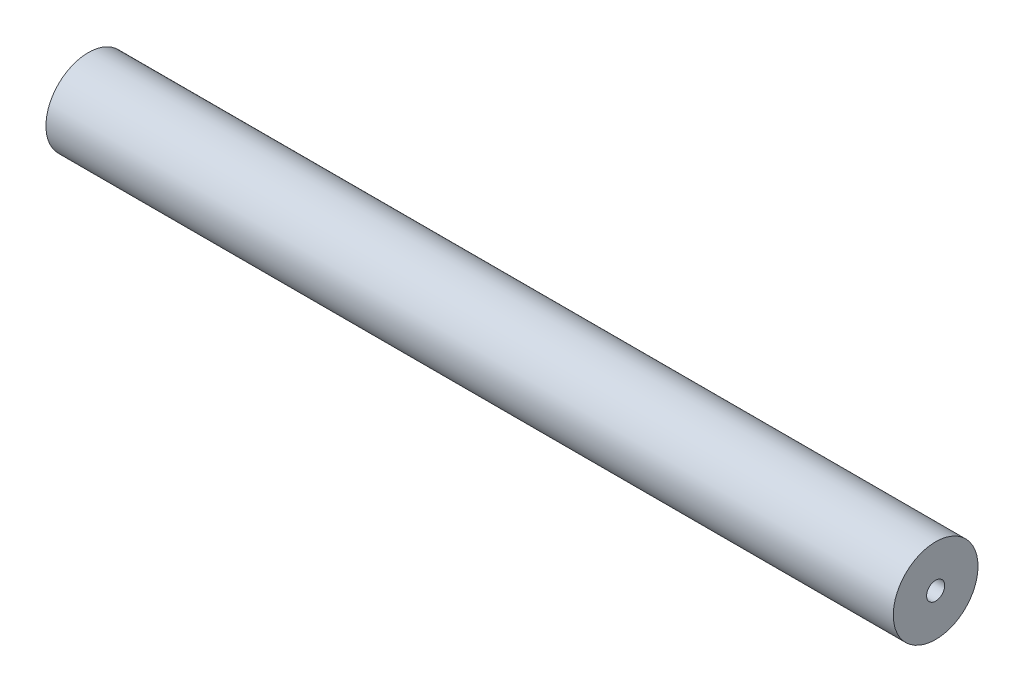
ISO-10303-21;
HEADER;
FILE_DESCRIPTION(('STEP AP214'),'2;1');
FILE_NAME('part.step','',(''),(''),'','','');
FILE_SCHEMA(('AUTOMOTIVE_DESIGN { 1 0 10303 214 1 1 1 1 }'));
ENDSEC;
DATA;
#1=APPLICATION_CONTEXT('core data for automotive mechanical design processes');
#2=APPLICATION_PROTOCOL_DEFINITION('international standard','automotive_design',2000,#1);
#3=PRODUCT_CONTEXT('',#1,'mechanical');
#4=PRODUCT('Part','Part','',(#3));
#5=PRODUCT_RELATED_PRODUCT_CATEGORY('part','',(#4));
#6=PRODUCT_DEFINITION_FORMATION('','',#4);
#7=PRODUCT_DEFINITION_CONTEXT('part definition',#1,'design');
#8=PRODUCT_DEFINITION('design','',#6,#7);
#9=PRODUCT_DEFINITION_SHAPE('','',#8);
#10=(LENGTH_UNIT() NAMED_UNIT(*) SI_UNIT(.MILLI.,.METRE.));
#11=(NAMED_UNIT(*) PLANE_ANGLE_UNIT() SI_UNIT($,.RADIAN.));
#12=(NAMED_UNIT(*) SI_UNIT($,.STERADIAN.) SOLID_ANGLE_UNIT());
#13=UNCERTAINTY_MEASURE_WITH_UNIT(LENGTH_MEASURE(1.E-05),#10,'distance_accuracy_value','');
#14=(GEOMETRIC_REPRESENTATION_CONTEXT(3) GLOBAL_UNCERTAINTY_ASSIGNED_CONTEXT((#13)) GLOBAL_UNIT_ASSIGNED_CONTEXT((#10,
#11,#12)) REPRESENTATION_CONTEXT('',''));
#15=CARTESIAN_POINT('',(0.,0.,0.));
#16=DIRECTION('',(0.,0.,1.));
#17=DIRECTION('',(1.,0.,0.));
#18=AXIS2_PLACEMENT_3D('',#15,#16,#17);
#19=CARTESIAN_POINT('',(150.,0.,0.));
#20=DIRECTION('',(1.,0.,0.));
#21=DIRECTION('',(0.,0.,-1.));
#22=AXIS2_PLACEMENT_3D('',#19,#20,#21);
#23=PLANE('',#22);
#24=CARTESIAN_POINT('',(150.,0.,0.));
#25=DIRECTION('',(1.,0.,0.));
#26=DIRECTION('',(0.,0.,-1.));
#27=AXIS2_PLACEMENT_3D('',#24,#25,#26);
#28=CIRCLE('',#27,7.5);
#29=CARTESIAN_POINT('',(150.,0.,-7.5));
#30=VERTEX_POINT('',#29);
#31=EDGE_CURVE('E10',#30,#30,#28,.T.);
#32=ORIENTED_EDGE('',*,*,#31,.T.);
#33=EDGE_LOOP('',(#32));
#34=FACE_BOUND('',#33,.T.);
#35=CARTESIAN_POINT('',(150.,0.,0.));
#36=DIRECTION('',(1.,0.,0.));
#37=DIRECTION('',(0.,0.,-1.));
#38=AXIS2_PLACEMENT_3D('',#35,#36,#37);
#39=CIRCLE('',#38,1.6);
#40=CARTESIAN_POINT('',(150.,0.,-1.6));
#41=VERTEX_POINT('',#40);
#42=EDGE_CURVE('E44',#41,#41,#39,.T.);
#43=ORIENTED_EDGE('',*,*,#42,.F.);
#44=EDGE_LOOP('',(#43));
#45=FACE_BOUND('',#44,.T.);
#46=ADVANCED_FACE('F33',(#34,#45),#23,.T.);
#47=CARTESIAN_POINT('',(0.,0.,0.));
#48=DIRECTION('',(1.,0.,0.));
#49=DIRECTION('',(0.,0.,-1.));
#50=AXIS2_PLACEMENT_3D('',#47,#48,#49);
#51=PLANE('',#50);
#52=CARTESIAN_POINT('',(0.,0.,0.));
#53=DIRECTION('',(1.,0.,0.));
#54=DIRECTION('',(0.,0.,-1.));
#55=AXIS2_PLACEMENT_3D('',#52,#53,#54);
#56=CIRCLE('',#55,7.5);
#57=CARTESIAN_POINT('',(0.,0.,-7.5));
#58=VERTEX_POINT('',#57);
#59=EDGE_CURVE('E37',#58,#58,#56,.T.);
#60=ORIENTED_EDGE('',*,*,#59,.F.);
#61=EDGE_LOOP('',(#60));
#62=FACE_BOUND('',#61,.T.);
#63=CARTESIAN_POINT('',(0.,0.,0.));
#64=DIRECTION('',(1.,0.,0.));
#65=DIRECTION('',(0.,0.,-1.));
#66=AXIS2_PLACEMENT_3D('',#63,#64,#65);
#67=CIRCLE('',#66,1.6);
#68=CARTESIAN_POINT('',(0.,0.,-1.6));
#69=VERTEX_POINT('',#68);
#70=EDGE_CURVE('E46',#69,#69,#67,.T.);
#71=ORIENTED_EDGE('',*,*,#70,.T.);
#72=EDGE_LOOP('',(#71));
#73=FACE_BOUND('',#72,.T.);
#74=ADVANCED_FACE('F56',(#62,#73),#51,.F.);
#75=CARTESIAN_POINT('',(150.,0.,0.));
#76=DIRECTION('',(-1.,0.,0.));
#77=DIRECTION('',(0.,0.,1.));
#78=AXIS2_PLACEMENT_3D('',#75,#76,#77);
#79=CYLINDRICAL_SURFACE('',#78,7.5);
#80=ORIENTED_EDGE('',*,*,#31,.F.);
#81=EDGE_LOOP('',(#80));
#82=FACE_BOUND('',#81,.T.);
#83=ORIENTED_EDGE('',*,*,#59,.T.);
#84=EDGE_LOOP('',(#83));
#85=FACE_BOUND('',#84,.T.);
#86=ADVANCED_FACE('F35',(#82,#85),#79,.T.);
#87=CARTESIAN_POINT('',(150.,0.,0.));
#88=DIRECTION('',(-1.,0.,0.));
#89=DIRECTION('',(0.,0.,1.));
#90=AXIS2_PLACEMENT_3D('',#87,#88,#89);
#91=CYLINDRICAL_SURFACE('',#90,1.6);
#92=ORIENTED_EDGE('',*,*,#42,.T.);
#93=EDGE_LOOP('',(#92));
#94=FACE_BOUND('',#93,.T.);
#95=ORIENTED_EDGE('',*,*,#70,.F.);
#96=EDGE_LOOP('',(#95));
#97=FACE_BOUND('',#96,.T.);
#98=ADVANCED_FACE('F52',(#94,#97),#91,.F.);
#99=CLOSED_SHELL('',(#46,#74,#86,#98));
#100=MANIFOLD_SOLID_BREP('B2',#99);
#101=ADVANCED_BREP_SHAPE_REPRESENTATION('',(#18,#100),#14);
#102=SHAPE_DEFINITION_REPRESENTATION(#9,#101);
ENDSEC;
END-ISO-10303-21;
